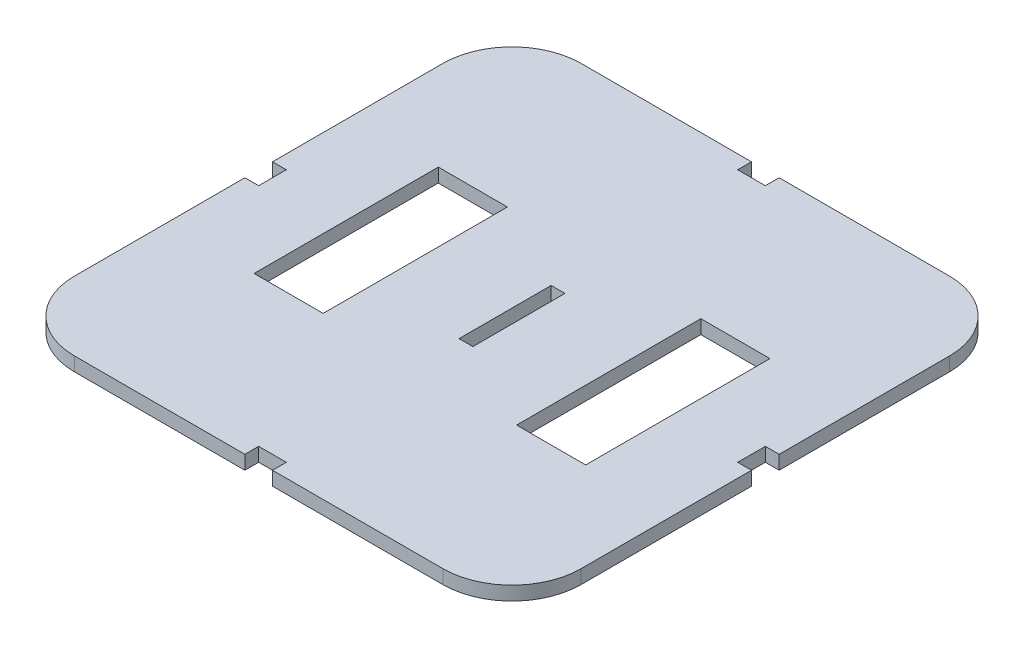
ISO-10303-21;
HEADER;
FILE_DESCRIPTION(('STEP AP214'),'2;1');
FILE_NAME('part.step','',(''),(''),'','','');
FILE_SCHEMA(('AUTOMOTIVE_DESIGN { 1 0 10303 214 1 1 1 1 }'));
ENDSEC;
DATA;
#1=APPLICATION_CONTEXT('core data for automotive mechanical design processes');
#2=APPLICATION_PROTOCOL_DEFINITION('international standard','automotive_design',2000,#1);
#3=PRODUCT_CONTEXT('',#1,'mechanical');
#4=PRODUCT('Part','Part','',(#3));
#5=PRODUCT_RELATED_PRODUCT_CATEGORY('part','',(#4));
#6=PRODUCT_DEFINITION_FORMATION('','',#4);
#7=PRODUCT_DEFINITION_CONTEXT('part definition',#1,'design');
#8=PRODUCT_DEFINITION('design','',#6,#7);
#9=PRODUCT_DEFINITION_SHAPE('','',#8);
#10=(LENGTH_UNIT() NAMED_UNIT(*) SI_UNIT(.MILLI.,.METRE.));
#11=(NAMED_UNIT(*) PLANE_ANGLE_UNIT() SI_UNIT($,.RADIAN.));
#12=(NAMED_UNIT(*) SI_UNIT($,.STERADIAN.) SOLID_ANGLE_UNIT());
#13=UNCERTAINTY_MEASURE_WITH_UNIT(LENGTH_MEASURE(1.E-05),#10,'distance_accuracy_value','');
#14=(GEOMETRIC_REPRESENTATION_CONTEXT(3) GLOBAL_UNCERTAINTY_ASSIGNED_CONTEXT((#13)) GLOBAL_UNIT_ASSIGNED_CONTEXT((#10,
#11,#12)) REPRESENTATION_CONTEXT('',''));
#15=CARTESIAN_POINT('',(0.,0.,0.));
#16=DIRECTION('',(0.,0.,1.));
#17=DIRECTION('',(1.,0.,0.));
#18=AXIS2_PLACEMENT_3D('',#15,#16,#17);
#19=CARTESIAN_POINT('',(0.,3.,-52.));
#20=DIRECTION('',(0.,0.,-1.));
#21=DIRECTION('',(-1.,0.,0.));
#22=AXIS2_PLACEMENT_3D('',#19,#20,#21);
#23=PLANE('',#22);
#24=DIRECTION('',(1.,0.,0.));
#25=VECTOR('',#24,1.);
#26=CARTESIAN_POINT('',(0.,0.,-52.));
#27=LINE('',#26,#25);
#28=CARTESIAN_POINT('',(107.,0.,-52.));
#29=VERTEX_POINT('',#28);
#30=CARTESIAN_POINT('',(110.,0.,-52.));
#31=VERTEX_POINT('',#30);
#32=EDGE_CURVE('E309',#29,#31,#27,.T.);
#33=ORIENTED_EDGE('',*,*,#32,.F.);
#34=DIRECTION('',(0.,-1.,0.));
#35=VECTOR('',#34,1.);
#36=CARTESIAN_POINT('',(107.,3.,-52.));
#37=LINE('',#36,#35);
#38=CARTESIAN_POINT('',(107.,3.,-52.));
#39=VERTEX_POINT('',#38);
#40=EDGE_CURVE('E483',#39,#29,#37,.T.);
#41=ORIENTED_EDGE('',*,*,#40,.F.);
#42=DIRECTION('',(1.,0.,0.));
#43=VECTOR('',#42,1.);
#44=CARTESIAN_POINT('',(0.,3.,-52.));
#45=LINE('',#44,#43);
#46=CARTESIAN_POINT('',(110.,3.,-52.));
#47=VERTEX_POINT('',#46);
#48=EDGE_CURVE('E350',#39,#47,#45,.T.);
#49=ORIENTED_EDGE('',*,*,#48,.T.);
#50=DIRECTION('',(0.,-1.,0.));
#51=VECTOR('',#50,1.);
#52=CARTESIAN_POINT('',(110.,3.,-52.));
#53=LINE('',#52,#51);
#54=EDGE_CURVE('E447',#47,#31,#53,.T.);
#55=ORIENTED_EDGE('',*,*,#54,.T.);
#56=EDGE_LOOP('',(#33,#41,#49,#55));
#57=FACE_BOUND('',#56,.T.);
#58=ADVANCED_FACE('F45',(#57),#23,.T.);
#59=CARTESIAN_POINT('',(107.,3.,0.));
#60=DIRECTION('',(1.,0.,0.));
#61=DIRECTION('',(0.,0.,-1.));
#62=AXIS2_PLACEMENT_3D('',#59,#60,#61);
#63=PLANE('',#62);
#64=DIRECTION('',(0.,0.,1.));
#65=VECTOR('',#64,1.);
#66=CARTESIAN_POINT('',(107.,0.,0.));
#67=LINE('',#66,#65);
#68=CARTESIAN_POINT('',(107.,0.,-58.));
#69=VERTEX_POINT('',#68);
#70=EDGE_CURVE('E402',#69,#29,#67,.T.);
#71=ORIENTED_EDGE('',*,*,#70,.F.);
#72=DIRECTION('',(0.,-1.,0.));
#73=VECTOR('',#72,1.);
#74=CARTESIAN_POINT('',(107.,3.,-58.));
#75=LINE('',#74,#73);
#76=CARTESIAN_POINT('',(107.,3.,-58.));
#77=VERTEX_POINT('',#76);
#78=EDGE_CURVE('E481',#77,#69,#75,.T.);
#79=ORIENTED_EDGE('',*,*,#78,.F.);
#80=DIRECTION('',(0.,0.,1.));
#81=VECTOR('',#80,1.);
#82=CARTESIAN_POINT('',(107.,3.,0.));
#83=LINE('',#82,#81);
#84=EDGE_CURVE('E353',#77,#39,#83,.T.);
#85=ORIENTED_EDGE('',*,*,#84,.T.);
#86=ORIENTED_EDGE('',*,*,#40,.T.);
#87=EDGE_LOOP('',(#71,#79,#85,#86));
#88=FACE_BOUND('',#87,.T.);
#89=ADVANCED_FACE('F569',(#88),#63,.T.);
#90=CARTESIAN_POINT('',(0.,3.,-58.));
#91=DIRECTION('',(0.,0.,-1.));
#92=DIRECTION('',(-1.,0.,0.));
#93=AXIS2_PLACEMENT_3D('',#90,#91,#92);
#94=PLANE('',#93);
#95=DIRECTION('',(1.,0.,0.));
#96=VECTOR('',#95,1.);
#97=CARTESIAN_POINT('',(0.,0.,-58.));
#98=LINE('',#97,#96);
#99=CARTESIAN_POINT('',(110.,0.,-58.));
#100=VERTEX_POINT('',#99);
#101=EDGE_CURVE('E405',#69,#100,#98,.T.);
#102=ORIENTED_EDGE('',*,*,#101,.T.);
#103=DIRECTION('',(0.,-1.,0.));
#104=VECTOR('',#103,1.);
#105=CARTESIAN_POINT('',(110.,3.,-58.));
#106=LINE('',#105,#104);
#107=CARTESIAN_POINT('',(110.,3.,-58.));
#108=VERTEX_POINT('',#107);
#109=EDGE_CURVE('E478',#108,#100,#106,.T.);
#110=ORIENTED_EDGE('',*,*,#109,.F.);
#111=DIRECTION('',(1.,0.,0.));
#112=VECTOR('',#111,1.);
#113=CARTESIAN_POINT('',(0.,3.,-58.));
#114=LINE('',#113,#112);
#115=EDGE_CURVE('E357',#77,#108,#114,.T.);
#116=ORIENTED_EDGE('',*,*,#115,.F.);
#117=ORIENTED_EDGE('',*,*,#78,.T.);
#118=EDGE_LOOP('',(#102,#110,#116,#117));
#119=FACE_BOUND('',#118,.T.);
#120=ADVANCED_FACE('F575',(#119),#94,.F.);
#121=CARTESIAN_POINT('',(110.,3.,0.));
#122=DIRECTION('',(-1.,0.,0.));
#123=DIRECTION('',(0.,0.,1.));
#124=AXIS2_PLACEMENT_3D('',#121,#122,#123);
#125=PLANE('',#124);
#126=DIRECTION('',(0.,0.,-1.));
#127=VECTOR('',#126,1.);
#128=CARTESIAN_POINT('',(110.,0.,0.));
#129=LINE('',#128,#127);
#130=CARTESIAN_POINT('',(110.,0.,-95.));
#131=VERTEX_POINT('',#130);
#132=EDGE_CURVE('E407',#100,#131,#129,.T.);
#133=ORIENTED_EDGE('',*,*,#132,.T.);
#134=DIRECTION('',(0.,-1.,0.));
#135=VECTOR('',#134,1.);
#136=CARTESIAN_POINT('',(110.,3.,-95.));
#137=LINE('',#136,#135);
#138=CARTESIAN_POINT('',(110.,3.,-95.));
#139=VERTEX_POINT('',#138);
#140=EDGE_CURVE('E514',#131,#139,#137,.F.);
#141=ORIENTED_EDGE('',*,*,#140,.T.);
#142=DIRECTION('',(0.,0.,-1.));
#143=VECTOR('',#142,1.);
#144=CARTESIAN_POINT('',(110.,3.,0.));
#145=LINE('',#144,#143);
#146=EDGE_CURVE('E359',#108,#139,#145,.T.);
#147=ORIENTED_EDGE('',*,*,#146,.F.);
#148=ORIENTED_EDGE('',*,*,#109,.T.);
#149=EDGE_LOOP('',(#133,#141,#147,#148));
#150=FACE_BOUND('',#149,.T.);
#151=ADVANCED_FACE('F687',(#150),#125,.F.);
#152=CARTESIAN_POINT('',(0.,3.,-110.));
#153=DIRECTION('',(0.,0.,-1.));
#154=DIRECTION('',(-1.,0.,0.));
#155=AXIS2_PLACEMENT_3D('',#152,#153,#154);
#156=PLANE('',#155);
#157=DIRECTION('',(1.,0.,0.));
#158=VECTOR('',#157,1.);
#159=CARTESIAN_POINT('',(0.,3.,-110.));
#160=LINE('',#159,#158);
#161=CARTESIAN_POINT('',(58.,3.,-110.));
#162=VERTEX_POINT('',#161);
#163=CARTESIAN_POINT('',(95.,3.,-110.));
#164=VERTEX_POINT('',#163);
#165=EDGE_CURVE('E362',#162,#164,#160,.T.);
#166=ORIENTED_EDGE('',*,*,#165,.T.);
#167=DIRECTION('',(0.,-1.,0.));
#168=VECTOR('',#167,1.);
#169=CARTESIAN_POINT('',(95.,0.,-110.));
#170=LINE('',#169,#168);
#171=CARTESIAN_POINT('',(95.,0.,-110.));
#172=VERTEX_POINT('',#171);
#173=EDGE_CURVE('E511',#164,#172,#170,.T.);
#174=ORIENTED_EDGE('',*,*,#173,.T.);
#175=DIRECTION('',(1.,0.,0.));
#176=VECTOR('',#175,1.);
#177=CARTESIAN_POINT('',(0.,0.,-110.));
#178=LINE('',#177,#176);
#179=CARTESIAN_POINT('',(58.,0.,-110.));
#180=VERTEX_POINT('',#179);
#181=EDGE_CURVE('E410',#180,#172,#178,.T.);
#182=ORIENTED_EDGE('',*,*,#181,.F.);
#183=DIRECTION('',(0.,-1.,0.));
#184=VECTOR('',#183,1.);
#185=CARTESIAN_POINT('',(58.,3.,-110.));
#186=LINE('',#185,#184);
#187=EDGE_CURVE('E476',#162,#180,#186,.T.);
#188=ORIENTED_EDGE('',*,*,#187,.F.);
#189=EDGE_LOOP('',(#166,#174,#182,#188));
#190=FACE_BOUND('',#189,.T.);
#191=ADVANCED_FACE('F605',(#190),#156,.T.);
#192=CARTESIAN_POINT('',(57.9999999999995,3.,2.68303897617744E-13));
#193=DIRECTION('',(-1.,0.,0.));
#194=DIRECTION('',(0.,0.,1.));
#195=AXIS2_PLACEMENT_3D('',#192,#193,#194);
#196=PLANE('',#195);
#197=DIRECTION('',(0.,0.,-1.));
#198=VECTOR('',#197,1.);
#199=CARTESIAN_POINT('',(57.9999999999995,0.,2.68303897617744E-13));
#200=LINE('',#199,#198);
#201=CARTESIAN_POINT('',(58.,0.,-107.));
#202=VERTEX_POINT('',#201);
#203=EDGE_CURVE('E413',#202,#180,#200,.T.);
#204=ORIENTED_EDGE('',*,*,#203,.F.);
#205=DIRECTION('',(0.,-1.,0.));
#206=VECTOR('',#205,1.);
#207=CARTESIAN_POINT('',(58.,3.,-107.));
#208=LINE('',#207,#206);
#209=CARTESIAN_POINT('',(58.,3.,-107.));
#210=VERTEX_POINT('',#209);
#211=EDGE_CURVE('E474',#210,#202,#208,.T.);
#212=ORIENTED_EDGE('',*,*,#211,.F.);
#213=DIRECTION('',(0.,0.,-1.));
#214=VECTOR('',#213,1.);
#215=CARTESIAN_POINT('',(57.9999999999995,3.,2.68303897617744E-13));
#216=LINE('',#215,#214);
#217=EDGE_CURVE('E366',#210,#162,#216,.T.);
#218=ORIENTED_EDGE('',*,*,#217,.T.);
#219=ORIENTED_EDGE('',*,*,#187,.T.);
#220=EDGE_LOOP('',(#204,#212,#218,#219));
#221=FACE_BOUND('',#220,.T.);
#222=ADVANCED_FACE('F609',(#221),#196,.T.);
#223=CARTESIAN_POINT('',(0.,3.,-107.));
#224=DIRECTION('',(0.,0.,-1.));
#225=DIRECTION('',(-1.,0.,0.));
#226=AXIS2_PLACEMENT_3D('',#223,#224,#225);
#227=PLANE('',#226);
#228=DIRECTION('',(1.,0.,0.));
#229=VECTOR('',#228,1.);
#230=CARTESIAN_POINT('',(0.,0.,-107.));
#231=LINE('',#230,#229);
#232=CARTESIAN_POINT('',(52.,0.,-107.));
#233=VERTEX_POINT('',#232);
#234=EDGE_CURVE('E417',#233,#202,#231,.T.);
#235=ORIENTED_EDGE('',*,*,#234,.F.);
#236=DIRECTION('',(0.,-1.,0.));
#237=VECTOR('',#236,1.);
#238=CARTESIAN_POINT('',(52.,3.,-107.));
#239=LINE('',#238,#237);
#240=CARTESIAN_POINT('',(52.,3.,-107.));
#241=VERTEX_POINT('',#240);
#242=EDGE_CURVE('E472',#241,#233,#239,.T.);
#243=ORIENTED_EDGE('',*,*,#242,.F.);
#244=DIRECTION('',(1.,0.,0.));
#245=VECTOR('',#244,1.);
#246=CARTESIAN_POINT('',(0.,3.,-107.));
#247=LINE('',#246,#245);
#248=EDGE_CURVE('E370',#241,#210,#247,.T.);
#249=ORIENTED_EDGE('',*,*,#248,.T.);
#250=ORIENTED_EDGE('',*,*,#211,.T.);
#251=EDGE_LOOP('',(#235,#243,#249,#250));
#252=FACE_BOUND('',#251,.T.);
#253=ADVANCED_FACE('F613',(#252),#227,.T.);
#254=CARTESIAN_POINT('',(51.9999999999995,3.,2.40548322002115E-13));
#255=DIRECTION('',(-1.,0.,0.));
#256=DIRECTION('',(0.,0.,1.));
#257=AXIS2_PLACEMENT_3D('',#254,#255,#256);
#258=PLANE('',#257);
#259=DIRECTION('',(0.,0.,-1.));
#260=VECTOR('',#259,1.);
#261=CARTESIAN_POINT('',(51.9999999999995,0.,2.40548322002115E-13));
#262=LINE('',#261,#260);
#263=CARTESIAN_POINT('',(52.,0.,-110.));
#264=VERTEX_POINT('',#263);
#265=EDGE_CURVE('E420',#233,#264,#262,.T.);
#266=ORIENTED_EDGE('',*,*,#265,.T.);
#267=DIRECTION('',(0.,-1.,0.));
#268=VECTOR('',#267,1.);
#269=CARTESIAN_POINT('',(52.,3.,-110.));
#270=LINE('',#269,#268);
#271=CARTESIAN_POINT('',(52.,3.,-110.));
#272=VERTEX_POINT('',#271);
#273=EDGE_CURVE('E469',#272,#264,#270,.T.);
#274=ORIENTED_EDGE('',*,*,#273,.F.);
#275=DIRECTION('',(0.,0.,-1.));
#276=VECTOR('',#275,1.);
#277=CARTESIAN_POINT('',(51.9999999999995,3.,2.40548322002115E-13));
#278=LINE('',#277,#276);
#279=EDGE_CURVE('E373',#241,#272,#278,.T.);
#280=ORIENTED_EDGE('',*,*,#279,.F.);
#281=ORIENTED_EDGE('',*,*,#242,.T.);
#282=EDGE_LOOP('',(#266,#274,#280,#281));
#283=FACE_BOUND('',#282,.T.);
#284=ADVANCED_FACE('F618',(#283),#258,.F.);
#285=CARTESIAN_POINT('',(15.,0.,-110.));
#286=VERTEX_POINT('',#285);
#287=EDGE_CURVE('E414',#286,#264,#178,.T.);
#288=ORIENTED_EDGE('',*,*,#287,.F.);
#289=DIRECTION('',(0.,-1.,0.));
#290=VECTOR('',#289,1.);
#291=CARTESIAN_POINT('',(15.,3.,-110.));
#292=LINE('',#291,#290);
#293=CARTESIAN_POINT('',(15.,3.,-110.));
#294=VERTEX_POINT('',#293);
#295=EDGE_CURVE('E496',#286,#294,#292,.F.);
#296=ORIENTED_EDGE('',*,*,#295,.T.);
#297=EDGE_CURVE('E367',#294,#272,#160,.T.);
#298=ORIENTED_EDGE('',*,*,#297,.T.);
#299=ORIENTED_EDGE('',*,*,#273,.T.);
#300=EDGE_LOOP('',(#288,#296,#298,#299));
#301=FACE_BOUND('',#300,.T.);
#302=ADVANCED_FACE('F702',(#301),#156,.T.);
#303=CARTESIAN_POINT('',(0.,3.,0.));
#304=DIRECTION('',(-1.,0.,0.));
#305=DIRECTION('',(0.,0.,1.));
#306=AXIS2_PLACEMENT_3D('',#303,#304,#305);
#307=PLANE('',#306);
#308=DIRECTION('',(0.,0.,-1.));
#309=VECTOR('',#308,1.);
#310=CARTESIAN_POINT('',(0.,3.,0.));
#311=LINE('',#310,#309);
#312=CARTESIAN_POINT('',(0.,3.,-58.));
#313=VERTEX_POINT('',#312);
#314=CARTESIAN_POINT('',(0.,3.,-95.));
#315=VERTEX_POINT('',#314);
#316=EDGE_CURVE('E376',#313,#315,#311,.T.);
#317=ORIENTED_EDGE('',*,*,#316,.T.);
#318=DIRECTION('',(0.,-1.,0.));
#319=VECTOR('',#318,1.);
#320=CARTESIAN_POINT('',(0.,3.,-95.));
#321=LINE('',#320,#319);
#322=CARTESIAN_POINT('',(0.,0.,-95.));
#323=VERTEX_POINT('',#322);
#324=EDGE_CURVE('E485',#315,#323,#321,.T.);
#325=ORIENTED_EDGE('',*,*,#324,.T.);
#326=DIRECTION('',(0.,0.,-1.));
#327=VECTOR('',#326,1.);
#328=CARTESIAN_POINT('',(0.,0.,0.));
#329=LINE('',#328,#327);
#330=CARTESIAN_POINT('',(0.,0.,-58.));
#331=VERTEX_POINT('',#330);
#332=EDGE_CURVE('E423',#331,#323,#329,.T.);
#333=ORIENTED_EDGE('',*,*,#332,.F.);
#334=DIRECTION('',(0.,-1.,0.));
#335=VECTOR('',#334,1.);
#336=CARTESIAN_POINT('',(0.,3.,-58.));
#337=LINE('',#336,#335);
#338=EDGE_CURVE('E467',#313,#331,#337,.T.);
#339=ORIENTED_EDGE('',*,*,#338,.F.);
#340=EDGE_LOOP('',(#317,#325,#333,#339));
#341=FACE_BOUND('',#340,.T.);
#342=ADVANCED_FACE('F626',(#341),#307,.T.);
#343=CARTESIAN_POINT('',(0.,3.,-58.));
#344=DIRECTION('',(0.,0.,1.));
#345=DIRECTION('',(1.,0.,0.));
#346=AXIS2_PLACEMENT_3D('',#343,#344,#345);
#347=PLANE('',#346);
#348=DIRECTION('',(-1.,0.,0.));
#349=VECTOR('',#348,1.);
#350=CARTESIAN_POINT('',(0.,0.,-58.));
#351=LINE('',#350,#349);
#352=CARTESIAN_POINT('',(3.,0.,-58.));
#353=VERTEX_POINT('',#352);
#354=EDGE_CURVE('E426',#353,#331,#351,.T.);
#355=ORIENTED_EDGE('',*,*,#354,.F.);
#356=DIRECTION('',(0.,-1.,0.));
#357=VECTOR('',#356,1.);
#358=CARTESIAN_POINT('',(3.,3.,-58.));
#359=LINE('',#358,#357);
#360=CARTESIAN_POINT('',(3.,3.,-58.));
#361=VERTEX_POINT('',#360);
#362=EDGE_CURVE('E465',#361,#353,#359,.T.);
#363=ORIENTED_EDGE('',*,*,#362,.F.);
#364=DIRECTION('',(-1.,0.,0.));
#365=VECTOR('',#364,1.);
#366=CARTESIAN_POINT('',(0.,3.,-58.));
#367=LINE('',#366,#365);
#368=EDGE_CURVE('E379',#361,#313,#367,.T.);
#369=ORIENTED_EDGE('',*,*,#368,.T.);
#370=ORIENTED_EDGE('',*,*,#338,.T.);
#371=EDGE_LOOP('',(#355,#363,#369,#370));
#372=FACE_BOUND('',#371,.T.);
#373=ADVANCED_FACE('F633',(#372),#347,.T.);
#374=CARTESIAN_POINT('',(3.,3.,0.));
#375=DIRECTION('',(-1.,0.,0.));
#376=DIRECTION('',(0.,0.,1.));
#377=AXIS2_PLACEMENT_3D('',#374,#375,#376);
#378=PLANE('',#377);
#379=DIRECTION('',(0.,0.,-1.));
#380=VECTOR('',#379,1.);
#381=CARTESIAN_POINT('',(3.,0.,0.));
#382=LINE('',#381,#380);
#383=CARTESIAN_POINT('',(3.,0.,-52.));
#384=VERTEX_POINT('',#383);
#385=EDGE_CURVE('E430',#384,#353,#382,.T.);
#386=ORIENTED_EDGE('',*,*,#385,.F.);
#387=DIRECTION('',(0.,-1.,0.));
#388=VECTOR('',#387,1.);
#389=CARTESIAN_POINT('',(3.,3.,-52.));
#390=LINE('',#389,#388);
#391=CARTESIAN_POINT('',(3.,3.,-52.));
#392=VERTEX_POINT('',#391);
#393=EDGE_CURVE('E463',#392,#384,#390,.T.);
#394=ORIENTED_EDGE('',*,*,#393,.F.);
#395=DIRECTION('',(0.,0.,-1.));
#396=VECTOR('',#395,1.);
#397=CARTESIAN_POINT('',(3.,3.,0.));
#398=LINE('',#397,#396);
#399=EDGE_CURVE('E383',#392,#361,#398,.T.);
#400=ORIENTED_EDGE('',*,*,#399,.T.);
#401=ORIENTED_EDGE('',*,*,#362,.T.);
#402=EDGE_LOOP('',(#386,#394,#400,#401));
#403=FACE_BOUND('',#402,.T.);
#404=ADVANCED_FACE('F637',(#403),#378,.T.);
#405=CARTESIAN_POINT('',(0.,3.,-52.));
#406=DIRECTION('',(0.,0.,1.));
#407=DIRECTION('',(1.,0.,0.));
#408=AXIS2_PLACEMENT_3D('',#405,#406,#407);
#409=PLANE('',#408);
#410=DIRECTION('',(-1.,0.,0.));
#411=VECTOR('',#410,1.);
#412=CARTESIAN_POINT('',(0.,0.,-52.));
#413=LINE('',#412,#411);
#414=CARTESIAN_POINT('',(0.,0.,-52.));
#415=VERTEX_POINT('',#414);
#416=EDGE_CURVE('E433',#384,#415,#413,.T.);
#417=ORIENTED_EDGE('',*,*,#416,.T.);
#418=DIRECTION('',(0.,-1.,0.));
#419=VECTOR('',#418,1.);
#420=CARTESIAN_POINT('',(0.,3.,-52.));
#421=LINE('',#420,#419);
#422=CARTESIAN_POINT('',(0.,3.,-52.));
#423=VERTEX_POINT('',#422);
#424=EDGE_CURVE('E460',#423,#415,#421,.T.);
#425=ORIENTED_EDGE('',*,*,#424,.F.);
#426=DIRECTION('',(-1.,0.,0.));
#427=VECTOR('',#426,1.);
#428=CARTESIAN_POINT('',(0.,3.,-52.));
#429=LINE('',#428,#427);
#430=EDGE_CURVE('E386',#392,#423,#429,.T.);
#431=ORIENTED_EDGE('',*,*,#430,.F.);
#432=ORIENTED_EDGE('',*,*,#393,.T.);
#433=EDGE_LOOP('',(#417,#425,#431,#432));
#434=FACE_BOUND('',#433,.T.);
#435=ADVANCED_FACE('F641',(#434),#409,.F.);
#436=CARTESIAN_POINT('',(0.,0.,-15.));
#437=VERTEX_POINT('',#436);
#438=EDGE_CURVE('E427',#437,#415,#329,.T.);
#439=ORIENTED_EDGE('',*,*,#438,.F.);
#440=DIRECTION('',(0.,-1.,0.));
#441=VECTOR('',#440,1.);
#442=CARTESIAN_POINT('',(0.,3.,-15.));
#443=LINE('',#442,#441);
#444=CARTESIAN_POINT('',(0.,3.,-15.));
#445=VERTEX_POINT('',#444);
#446=EDGE_CURVE('E509',#437,#445,#443,.F.);
#447=ORIENTED_EDGE('',*,*,#446,.T.);
#448=EDGE_CURVE('E380',#445,#423,#311,.T.);
#449=ORIENTED_EDGE('',*,*,#448,.T.);
#450=ORIENTED_EDGE('',*,*,#424,.T.);
#451=EDGE_LOOP('',(#439,#447,#449,#450));
#452=FACE_BOUND('',#451,.T.);
#453=ADVANCED_FACE('F690',(#452),#307,.T.);
#454=CARTESIAN_POINT('',(0.,3.,0.));
#455=DIRECTION('',(0.,0.,-1.));
#456=DIRECTION('',(-1.,0.,0.));
#457=AXIS2_PLACEMENT_3D('',#454,#455,#456);
#458=PLANE('',#457);
#459=DIRECTION('',(1.,0.,0.));
#460=VECTOR('',#459,1.);
#461=CARTESIAN_POINT('',(0.,3.,0.));
#462=LINE('',#461,#460);
#463=CARTESIAN_POINT('',(15.,3.,0.));
#464=VERTEX_POINT('',#463);
#465=CARTESIAN_POINT('',(52.,3.,0.));
#466=VERTEX_POINT('',#465);
#467=EDGE_CURVE('E389',#464,#466,#462,.T.);
#468=ORIENTED_EDGE('',*,*,#467,.F.);
#469=DIRECTION('',(0.,-1.,0.));
#470=VECTOR('',#469,1.);
#471=CARTESIAN_POINT('',(15.,0.,0.));
#472=LINE('',#471,#470);
#473=CARTESIAN_POINT('',(15.,0.,0.));
#474=VERTEX_POINT('',#473);
#475=EDGE_CURVE('E506',#464,#474,#472,.T.);
#476=ORIENTED_EDGE('',*,*,#475,.T.);
#477=DIRECTION('',(1.,0.,0.));
#478=VECTOR('',#477,1.);
#479=CARTESIAN_POINT('',(0.,0.,0.));
#480=LINE('',#479,#478);
#481=CARTESIAN_POINT('',(52.,0.,0.));
#482=VERTEX_POINT('',#481);
#483=EDGE_CURVE('E436',#474,#482,#480,.T.);
#484=ORIENTED_EDGE('',*,*,#483,.T.);
#485=DIRECTION('',(0.,-1.,0.));
#486=VECTOR('',#485,1.);
#487=CARTESIAN_POINT('',(52.,3.,0.));
#488=LINE('',#487,#486);
#489=EDGE_CURVE('E457',#466,#482,#488,.T.);
#490=ORIENTED_EDGE('',*,*,#489,.F.);
#491=EDGE_LOOP('',(#468,#476,#484,#490));
#492=FACE_BOUND('',#491,.T.);
#493=ADVANCED_FACE('F650',(#492),#458,.F.);
#494=CARTESIAN_POINT('',(52.,3.,-2.40548322002117E-13));
#495=DIRECTION('',(1.,0.,0.));
#496=DIRECTION('',(0.,0.,-1.));
#497=AXIS2_PLACEMENT_3D('',#494,#495,#496);
#498=PLANE('',#497);
#499=DIRECTION('',(0.,0.,1.));
#500=VECTOR('',#499,1.);
#501=CARTESIAN_POINT('',(52.,0.,-2.40548322002117E-13));
#502=LINE('',#501,#500);
#503=CARTESIAN_POINT('',(52.,0.,-3.));
#504=VERTEX_POINT('',#503);
#505=EDGE_CURVE('E438',#504,#482,#502,.T.);
#506=ORIENTED_EDGE('',*,*,#505,.F.);
#507=DIRECTION('',(0.,-1.,0.));
#508=VECTOR('',#507,1.);
#509=CARTESIAN_POINT('',(52.,3.,-3.));
#510=LINE('',#509,#508);
#511=CARTESIAN_POINT('',(52.,3.,-3.));
#512=VERTEX_POINT('',#511);
#513=EDGE_CURVE('E455',#512,#504,#510,.T.);
#514=ORIENTED_EDGE('',*,*,#513,.F.);
#515=DIRECTION('',(0.,0.,1.));
#516=VECTOR('',#515,1.);
#517=CARTESIAN_POINT('',(52.,3.,-2.40548322002117E-13));
#518=LINE('',#517,#516);
#519=EDGE_CURVE('E391',#512,#466,#518,.T.);
#520=ORIENTED_EDGE('',*,*,#519,.T.);
#521=ORIENTED_EDGE('',*,*,#489,.T.);
#522=EDGE_LOOP('',(#506,#514,#520,#521));
#523=FACE_BOUND('',#522,.T.);
#524=ADVANCED_FACE('F657',(#523),#498,.T.);
#525=CARTESIAN_POINT('',(0.,3.,-3.));
#526=DIRECTION('',(0.,0.,1.));
#527=DIRECTION('',(1.,0.,0.));
#528=AXIS2_PLACEMENT_3D('',#525,#526,#527);
#529=PLANE('',#528);
#530=DIRECTION('',(-1.,0.,0.));
#531=VECTOR('',#530,1.);
#532=CARTESIAN_POINT('',(0.,0.,-3.));
#533=LINE('',#532,#531);
#534=CARTESIAN_POINT('',(58.,0.,-3.));
#535=VERTEX_POINT('',#534);
#536=EDGE_CURVE('E442',#535,#504,#533,.T.);
#537=ORIENTED_EDGE('',*,*,#536,.F.);
#538=DIRECTION('',(0.,-1.,0.));
#539=VECTOR('',#538,1.);
#540=CARTESIAN_POINT('',(58.,3.,-3.));
#541=LINE('',#540,#539);
#542=CARTESIAN_POINT('',(58.,3.,-3.));
#543=VERTEX_POINT('',#542);
#544=EDGE_CURVE('E453',#543,#535,#541,.T.);
#545=ORIENTED_EDGE('',*,*,#544,.F.);
#546=DIRECTION('',(-1.,0.,0.));
#547=VECTOR('',#546,1.);
#548=CARTESIAN_POINT('',(0.,3.,-3.));
#549=LINE('',#548,#547);
#550=EDGE_CURVE('E395',#543,#512,#549,.T.);
#551=ORIENTED_EDGE('',*,*,#550,.T.);
#552=ORIENTED_EDGE('',*,*,#513,.T.);
#553=EDGE_LOOP('',(#537,#545,#551,#552));
#554=FACE_BOUND('',#553,.T.);
#555=ADVANCED_FACE('F661',(#554),#529,.T.);
#556=CARTESIAN_POINT('',(58.,3.,-2.68303897617746E-13));
#557=DIRECTION('',(1.,0.,0.));
#558=DIRECTION('',(0.,0.,-1.));
#559=AXIS2_PLACEMENT_3D('',#556,#557,#558);
#560=PLANE('',#559);
#561=DIRECTION('',(0.,0.,1.));
#562=VECTOR('',#561,1.);
#563=CARTESIAN_POINT('',(58.,0.,-2.68303897617746E-13));
#564=LINE('',#563,#562);
#565=CARTESIAN_POINT('',(58.,0.,0.));
#566=VERTEX_POINT('',#565);
#567=EDGE_CURVE('E445',#535,#566,#564,.T.);
#568=ORIENTED_EDGE('',*,*,#567,.T.);
#569=DIRECTION('',(0.,-1.,0.));
#570=VECTOR('',#569,1.);
#571=CARTESIAN_POINT('',(58.,3.,0.));
#572=LINE('',#571,#570);
#573=CARTESIAN_POINT('',(58.,3.,0.));
#574=VERTEX_POINT('',#573);
#575=EDGE_CURVE('E450',#574,#566,#572,.T.);
#576=ORIENTED_EDGE('',*,*,#575,.F.);
#577=DIRECTION('',(0.,0.,1.));
#578=VECTOR('',#577,1.);
#579=CARTESIAN_POINT('',(58.,3.,-2.68303897617746E-13));
#580=LINE('',#579,#578);
#581=EDGE_CURVE('E398',#543,#574,#580,.T.);
#582=ORIENTED_EDGE('',*,*,#581,.F.);
#583=ORIENTED_EDGE('',*,*,#544,.T.);
#584=EDGE_LOOP('',(#568,#576,#582,#583));
#585=FACE_BOUND('',#584,.T.);
#586=ADVANCED_FACE('F665',(#585),#560,.F.);
#587=CARTESIAN_POINT('',(95.,0.,0.));
#588=VERTEX_POINT('',#587);
#589=EDGE_CURVE('E439',#566,#588,#480,.T.);
#590=ORIENTED_EDGE('',*,*,#589,.T.);
#591=DIRECTION('',(0.,-1.,0.));
#592=VECTOR('',#591,1.);
#593=CARTESIAN_POINT('',(95.,3.,0.));
#594=LINE('',#593,#592);
#595=CARTESIAN_POINT('',(95.,3.,0.));
#596=VERTEX_POINT('',#595);
#597=EDGE_CURVE('E519',#588,#596,#594,.F.);
#598=ORIENTED_EDGE('',*,*,#597,.T.);
#599=EDGE_CURVE('E392',#574,#596,#462,.T.);
#600=ORIENTED_EDGE('',*,*,#599,.F.);
#601=ORIENTED_EDGE('',*,*,#575,.T.);
#602=EDGE_LOOP('',(#590,#598,#600,#601));
#603=FACE_BOUND('',#602,.T.);
#604=ADVANCED_FACE('F679',(#603),#458,.F.);
#605=CARTESIAN_POINT('',(110.,3.,-15.));
#606=VERTEX_POINT('',#605);
#607=EDGE_CURVE('E363',#606,#47,#145,.T.);
#608=ORIENTED_EDGE('',*,*,#607,.F.);
#609=DIRECTION('',(0.,-1.,0.));
#610=VECTOR('',#609,1.);
#611=CARTESIAN_POINT('',(110.,3.,-15.));
#612=LINE('',#611,#610);
#613=CARTESIAN_POINT('',(110.,0.,-15.));
#614=VERTEX_POINT('',#613);
#615=EDGE_CURVE('E516',#606,#614,#612,.T.);
#616=ORIENTED_EDGE('',*,*,#615,.T.);
#617=EDGE_CURVE('E354',#614,#31,#129,.T.);
#618=ORIENTED_EDGE('',*,*,#617,.T.);
#619=ORIENTED_EDGE('',*,*,#54,.F.);
#620=EDGE_LOOP('',(#608,#616,#618,#619));
#621=FACE_BOUND('',#620,.T.);
#622=ADVANCED_FACE('F675',(#621),#125,.F.);
#623=CARTESIAN_POINT('',(0.,3.,0.));
#624=DIRECTION('',(0.,1.,0.));
#625=DIRECTION('',(0.,0.,1.));
#626=AXIS2_PLACEMENT_3D('',#623,#624,#625);
#627=PLANE('',#626);
#628=DIRECTION('',(0.,0.,1.));
#629=VECTOR('',#628,1.);
#630=CARTESIAN_POINT('',(19.,3.,-75.));
#631=LINE('',#630,#629);
#632=CARTESIAN_POINT('',(19.,3.,-75.));
#633=VERTEX_POINT('',#632);
#634=CARTESIAN_POINT('',(19.,3.,-35.));
#635=VERTEX_POINT('',#634);
#636=EDGE_CURVE('E60',#633,#635,#631,.T.);
#637=ORIENTED_EDGE('',*,*,#636,.F.);
#638=DIRECTION('',(-1.,0.,0.));
#639=VECTOR('',#638,1.);
#640=CARTESIAN_POINT('',(19.,3.,-75.));
#641=LINE('',#640,#639);
#642=CARTESIAN_POINT('',(34.,3.,-75.0000000000001));
#643=VERTEX_POINT('',#642);
#644=EDGE_CURVE('E302',#643,#633,#641,.T.);
#645=ORIENTED_EDGE('',*,*,#644,.F.);
#646=DIRECTION('',(0.,0.,-1.));
#647=VECTOR('',#646,1.);
#648=CARTESIAN_POINT('',(34.,3.,-75.0000000000001));
#649=LINE('',#648,#647);
#650=CARTESIAN_POINT('',(34.,3.,-35.));
#651=VERTEX_POINT('',#650);
#652=EDGE_CURVE('E285',#651,#643,#649,.T.);
#653=ORIENTED_EDGE('',*,*,#652,.F.);
#654=DIRECTION('',(1.,0.,0.));
#655=VECTOR('',#654,1.);
#656=CARTESIAN_POINT('',(19.,3.,-35.));
#657=LINE('',#656,#655);
#658=EDGE_CURVE('E295',#635,#651,#657,.T.);
#659=ORIENTED_EDGE('',*,*,#658,.F.);
#660=EDGE_LOOP('',(#637,#645,#653,#659));
#661=FACE_BOUND('',#660,.T.);
#662=DIRECTION('',(0.,0.,1.));
#663=VECTOR('',#662,1.);
#664=CARTESIAN_POINT('',(53.5,3.,-65.));
#665=LINE('',#664,#663);
#666=CARTESIAN_POINT('',(53.5,3.,-65.));
#667=VERTEX_POINT('',#666);
#668=CARTESIAN_POINT('',(53.5,3.,-45.));
#669=VERTEX_POINT('',#668);
#670=EDGE_CURVE('E68',#667,#669,#665,.T.);
#671=ORIENTED_EDGE('',*,*,#670,.F.);
#672=DIRECTION('',(-1.,0.,0.));
#673=VECTOR('',#672,1.);
#674=CARTESIAN_POINT('',(53.5,3.,-65.));
#675=LINE('',#674,#673);
#676=CARTESIAN_POINT('',(56.5,3.,-65.));
#677=VERTEX_POINT('',#676);
#678=EDGE_CURVE('E314',#677,#667,#675,.T.);
#679=ORIENTED_EDGE('',*,*,#678,.F.);
#680=DIRECTION('',(0.,0.,-1.));
#681=VECTOR('',#680,1.);
#682=CARTESIAN_POINT('',(56.5,3.,-65.));
#683=LINE('',#682,#681);
#684=CARTESIAN_POINT('',(56.5,3.,-45.));
#685=VERTEX_POINT('',#684);
#686=EDGE_CURVE('E324',#685,#677,#683,.T.);
#687=ORIENTED_EDGE('',*,*,#686,.F.);
#688=DIRECTION('',(1.,0.,0.));
#689=VECTOR('',#688,1.);
#690=CARTESIAN_POINT('',(53.5,3.,-45.));
#691=LINE('',#690,#689);
#692=EDGE_CURVE('E327',#669,#685,#691,.T.);
#693=ORIENTED_EDGE('',*,*,#692,.F.);
#694=EDGE_LOOP('',(#671,#679,#687,#693));
#695=FACE_BOUND('',#694,.T.);
#696=DIRECTION('',(0.,0.,1.));
#697=VECTOR('',#696,1.);
#698=CARTESIAN_POINT('',(76.,3.,-75.0000000000001));
#699=LINE('',#698,#697);
#700=CARTESIAN_POINT('',(76.,3.,-75.0000000000001));
#701=VERTEX_POINT('',#700);
#702=CARTESIAN_POINT('',(76.,3.,-35.));
#703=VERTEX_POINT('',#702);
#704=EDGE_CURVE('E321',#701,#703,#699,.T.);
#705=ORIENTED_EDGE('',*,*,#704,.F.);
#706=DIRECTION('',(-1.,0.,0.));
#707=VECTOR('',#706,1.);
#708=CARTESIAN_POINT('',(76.,3.,-75.0000000000001));
#709=LINE('',#708,#707);
#710=CARTESIAN_POINT('',(91.,3.,-75.0000000000001));
#711=VERTEX_POINT('',#710);
#712=EDGE_CURVE('E334',#711,#701,#709,.T.);
#713=ORIENTED_EDGE('',*,*,#712,.F.);
#714=DIRECTION('',(0.,0.,-1.));
#715=VECTOR('',#714,1.);
#716=CARTESIAN_POINT('',(91.,3.,-75.0000000000001));
#717=LINE('',#716,#715);
#718=CARTESIAN_POINT('',(91.,3.,-35.));
#719=VERTEX_POINT('',#718);
#720=EDGE_CURVE('E343',#719,#711,#717,.T.);
#721=ORIENTED_EDGE('',*,*,#720,.F.);
#722=DIRECTION('',(1.,0.,0.));
#723=VECTOR('',#722,1.);
#724=CARTESIAN_POINT('',(76.,3.,-35.));
#725=LINE('',#724,#723);
#726=EDGE_CURVE('E346',#703,#719,#725,.T.);
#727=ORIENTED_EDGE('',*,*,#726,.F.);
#728=EDGE_LOOP('',(#705,#713,#721,#727));
#729=FACE_BOUND('',#728,.T.);
#730=ORIENTED_EDGE('',*,*,#297,.F.);
#731=CARTESIAN_POINT('',(15.,3.,-95.));
#732=DIRECTION('',(0.,1.,0.));
#733=DIRECTION('',(0.,0.,1.));
#734=AXIS2_PLACEMENT_3D('',#731,#732,#733);
#735=CIRCLE('',#734,15.);
#736=EDGE_CURVE('E504',#294,#315,#735,.T.);
#737=ORIENTED_EDGE('',*,*,#736,.T.);
#738=ORIENTED_EDGE('',*,*,#316,.F.);
#739=ORIENTED_EDGE('',*,*,#368,.F.);
#740=ORIENTED_EDGE('',*,*,#399,.F.);
#741=ORIENTED_EDGE('',*,*,#430,.T.);
#742=ORIENTED_EDGE('',*,*,#448,.F.);
#743=CARTESIAN_POINT('',(15.,3.,-15.));
#744=DIRECTION('',(0.,1.,0.));
#745=DIRECTION('',(0.,0.,1.));
#746=AXIS2_PLACEMENT_3D('',#743,#744,#745);
#747=CIRCLE('',#746,15.);
#748=EDGE_CURVE('E502',#445,#464,#747,.T.);
#749=ORIENTED_EDGE('',*,*,#748,.T.);
#750=ORIENTED_EDGE('',*,*,#467,.T.);
#751=ORIENTED_EDGE('',*,*,#519,.F.);
#752=ORIENTED_EDGE('',*,*,#550,.F.);
#753=ORIENTED_EDGE('',*,*,#581,.T.);
#754=ORIENTED_EDGE('',*,*,#599,.T.);
#755=CARTESIAN_POINT('',(95.,3.,-15.));
#756=DIRECTION('',(0.,1.,0.));
#757=DIRECTION('',(0.,0.,1.));
#758=AXIS2_PLACEMENT_3D('',#755,#756,#757);
#759=CIRCLE('',#758,15.);
#760=EDGE_CURVE('E498',#596,#606,#759,.T.);
#761=ORIENTED_EDGE('',*,*,#760,.T.);
#762=ORIENTED_EDGE('',*,*,#607,.T.);
#763=ORIENTED_EDGE('',*,*,#48,.F.);
#764=ORIENTED_EDGE('',*,*,#84,.F.);
#765=ORIENTED_EDGE('',*,*,#115,.T.);
#766=ORIENTED_EDGE('',*,*,#146,.T.);
#767=CARTESIAN_POINT('',(95.,3.,-95.));
#768=DIRECTION('',(0.,1.,0.));
#769=DIRECTION('',(0.,0.,1.));
#770=AXIS2_PLACEMENT_3D('',#767,#768,#769);
#771=CIRCLE('',#770,15.);
#772=EDGE_CURVE('E500',#139,#164,#771,.T.);
#773=ORIENTED_EDGE('',*,*,#772,.T.);
#774=ORIENTED_EDGE('',*,*,#165,.F.);
#775=ORIENTED_EDGE('',*,*,#217,.F.);
#776=ORIENTED_EDGE('',*,*,#248,.F.);
#777=ORIENTED_EDGE('',*,*,#279,.T.);
#778=EDGE_LOOP('',(#730,#737,#738,#739,#740,#741,#742,#749,#750,#751,#752,#753,#754,#761,#762,
#763,#764,#765,#766,#773,#774,#775,#776,#777));
#779=FACE_BOUND('',#778,.T.);
#780=ADVANCED_FACE('F299',(#661,#695,#729,#779),#627,.T.);
#781=CARTESIAN_POINT('',(0.,0.,0.));
#782=DIRECTION('',(0.,1.,0.));
#783=DIRECTION('',(0.,0.,1.));
#784=AXIS2_PLACEMENT_3D('',#781,#782,#783);
#785=PLANE('',#784);
#786=DIRECTION('',(-1.,0.,0.));
#787=VECTOR('',#786,1.);
#788=CARTESIAN_POINT('',(0.,0.,-75.));
#789=LINE('',#788,#787);
#790=CARTESIAN_POINT('',(34.,0.,-75.0000000000001));
#791=VERTEX_POINT('',#790);
#792=CARTESIAN_POINT('',(19.,0.,-75.));
#793=VERTEX_POINT('',#792);
#794=EDGE_CURVE('E53',#791,#793,#789,.T.);
#795=ORIENTED_EDGE('',*,*,#794,.T.);
#796=DIRECTION('',(0.,0.,1.));
#797=VECTOR('',#796,1.);
#798=CARTESIAN_POINT('',(19.,0.,0.));
#799=LINE('',#798,#797);
#800=CARTESIAN_POINT('',(19.,0.,-35.));
#801=VERTEX_POINT('',#800);
#802=EDGE_CURVE('E11',#793,#801,#799,.T.);
#803=ORIENTED_EDGE('',*,*,#802,.T.);
#804=DIRECTION('',(1.,0.,0.));
#805=VECTOR('',#804,1.);
#806=CARTESIAN_POINT('',(0.,0.,-35.));
#807=LINE('',#806,#805);
#808=CARTESIAN_POINT('',(34.,0.,-35.));
#809=VERTEX_POINT('',#808);
#810=EDGE_CURVE('E545',#801,#809,#807,.T.);
#811=ORIENTED_EDGE('',*,*,#810,.T.);
#812=DIRECTION('',(0.,0.,-1.));
#813=VECTOR('',#812,1.);
#814=CARTESIAN_POINT('',(34.,0.,0.));
#815=LINE('',#814,#813);
#816=EDGE_CURVE('E288',#809,#791,#815,.T.);
#817=ORIENTED_EDGE('',*,*,#816,.T.);
#818=EDGE_LOOP('',(#795,#803,#811,#817));
#819=FACE_BOUND('',#818,.T.);
#820=DIRECTION('',(-1.,0.,0.));
#821=VECTOR('',#820,1.);
#822=CARTESIAN_POINT('',(0.,0.,-65.));
#823=LINE('',#822,#821);
#824=CARTESIAN_POINT('',(56.5,0.,-65.));
#825=VERTEX_POINT('',#824);
#826=CARTESIAN_POINT('',(53.5,0.,-65.));
#827=VERTEX_POINT('',#826);
#828=EDGE_CURVE('E539',#825,#827,#823,.T.);
#829=ORIENTED_EDGE('',*,*,#828,.T.);
#830=DIRECTION('',(0.,0.,1.));
#831=VECTOR('',#830,1.);
#832=CARTESIAN_POINT('',(53.5,0.,0.));
#833=LINE('',#832,#831);
#834=CARTESIAN_POINT('',(53.5,0.,-45.));
#835=VERTEX_POINT('',#834);
#836=EDGE_CURVE('E542',#827,#835,#833,.T.);
#837=ORIENTED_EDGE('',*,*,#836,.T.);
#838=DIRECTION('',(1.,0.,0.));
#839=VECTOR('',#838,1.);
#840=CARTESIAN_POINT('',(0.,0.,-45.));
#841=LINE('',#840,#839);
#842=CARTESIAN_POINT('',(56.5,0.,-45.));
#843=VERTEX_POINT('',#842);
#844=EDGE_CURVE('E533',#835,#843,#841,.T.);
#845=ORIENTED_EDGE('',*,*,#844,.T.);
#846=DIRECTION('',(0.,0.,-1.));
#847=VECTOR('',#846,1.);
#848=CARTESIAN_POINT('',(56.5,0.,0.));
#849=LINE('',#848,#847);
#850=EDGE_CURVE('E536',#843,#825,#849,.T.);
#851=ORIENTED_EDGE('',*,*,#850,.T.);
#852=EDGE_LOOP('',(#829,#837,#845,#851));
#853=FACE_BOUND('',#852,.T.);
#854=DIRECTION('',(-1.,0.,0.));
#855=VECTOR('',#854,1.);
#856=CARTESIAN_POINT('',(0.,0.,-75.0000000000001));
#857=LINE('',#856,#855);
#858=CARTESIAN_POINT('',(91.,0.,-75.0000000000001));
#859=VERTEX_POINT('',#858);
#860=CARTESIAN_POINT('',(76.,0.,-75.0000000000001));
#861=VERTEX_POINT('',#860);
#862=EDGE_CURVE('E527',#859,#861,#857,.T.);
#863=ORIENTED_EDGE('',*,*,#862,.T.);
#864=DIRECTION('',(0.,0.,1.));
#865=VECTOR('',#864,1.);
#866=CARTESIAN_POINT('',(76.,0.,0.));
#867=LINE('',#866,#865);
#868=CARTESIAN_POINT('',(76.,0.,-35.));
#869=VERTEX_POINT('',#868);
#870=EDGE_CURVE('E530',#861,#869,#867,.T.);
#871=ORIENTED_EDGE('',*,*,#870,.T.);
#872=DIRECTION('',(1.,0.,0.));
#873=VECTOR('',#872,1.);
#874=CARTESIAN_POINT('',(0.,0.,-35.));
#875=LINE('',#874,#873);
#876=CARTESIAN_POINT('',(91.,0.,-35.));
#877=VERTEX_POINT('',#876);
#878=EDGE_CURVE('E521',#869,#877,#875,.T.);
#879=ORIENTED_EDGE('',*,*,#878,.T.);
#880=DIRECTION('',(0.,0.,-1.));
#881=VECTOR('',#880,1.);
#882=CARTESIAN_POINT('',(91.,0.,0.));
#883=LINE('',#882,#881);
#884=EDGE_CURVE('E524',#877,#859,#883,.T.);
#885=ORIENTED_EDGE('',*,*,#884,.T.);
#886=EDGE_LOOP('',(#863,#871,#879,#885));
#887=FACE_BOUND('',#886,.T.);
#888=ORIENTED_EDGE('',*,*,#332,.T.);
#889=CARTESIAN_POINT('',(15.,0.,-95.));
#890=DIRECTION('',(0.,1.,0.));
#891=DIRECTION('',(0.,0.,1.));
#892=AXIS2_PLACEMENT_3D('',#889,#890,#891);
#893=CIRCLE('',#892,15.);
#894=EDGE_CURVE('E494',#323,#286,#893,.F.);
#895=ORIENTED_EDGE('',*,*,#894,.T.);
#896=ORIENTED_EDGE('',*,*,#287,.T.);
#897=ORIENTED_EDGE('',*,*,#265,.F.);
#898=ORIENTED_EDGE('',*,*,#234,.T.);
#899=ORIENTED_EDGE('',*,*,#203,.T.);
#900=ORIENTED_EDGE('',*,*,#181,.T.);
#901=CARTESIAN_POINT('',(95.,0.,-95.));
#902=DIRECTION('',(0.,1.,0.));
#903=DIRECTION('',(0.,0.,1.));
#904=AXIS2_PLACEMENT_3D('',#901,#902,#903);
#905=CIRCLE('',#904,15.);
#906=EDGE_CURVE('E490',#172,#131,#905,.F.);
#907=ORIENTED_EDGE('',*,*,#906,.T.);
#908=ORIENTED_EDGE('',*,*,#132,.F.);
#909=ORIENTED_EDGE('',*,*,#101,.F.);
#910=ORIENTED_EDGE('',*,*,#70,.T.);
#911=ORIENTED_EDGE('',*,*,#32,.T.);
#912=ORIENTED_EDGE('',*,*,#617,.F.);
#913=CARTESIAN_POINT('',(95.,0.,-15.));
#914=DIRECTION('',(0.,1.,0.));
#915=DIRECTION('',(0.,0.,1.));
#916=AXIS2_PLACEMENT_3D('',#913,#914,#915);
#917=CIRCLE('',#916,15.);
#918=EDGE_CURVE('E488',#614,#588,#917,.F.);
#919=ORIENTED_EDGE('',*,*,#918,.T.);
#920=ORIENTED_EDGE('',*,*,#589,.F.);
#921=ORIENTED_EDGE('',*,*,#567,.F.);
#922=ORIENTED_EDGE('',*,*,#536,.T.);
#923=ORIENTED_EDGE('',*,*,#505,.T.);
#924=ORIENTED_EDGE('',*,*,#483,.F.);
#925=CARTESIAN_POINT('',(15.,0.,-15.));
#926=DIRECTION('',(0.,1.,0.));
#927=DIRECTION('',(0.,0.,1.));
#928=AXIS2_PLACEMENT_3D('',#925,#926,#927);
#929=CIRCLE('',#928,15.);
#930=EDGE_CURVE('E492',#474,#437,#929,.F.);
#931=ORIENTED_EDGE('',*,*,#930,.T.);
#932=ORIENTED_EDGE('',*,*,#438,.T.);
#933=ORIENTED_EDGE('',*,*,#416,.F.);
#934=ORIENTED_EDGE('',*,*,#385,.T.);
#935=ORIENTED_EDGE('',*,*,#354,.T.);
#936=EDGE_LOOP('',(#888,#895,#896,#897,#898,#899,#900,#907,#908,#909,#910,#911,#912,#919,#920,
#921,#922,#923,#924,#931,#932,#933,#934,#935));
#937=FACE_BOUND('',#936,.T.);
#938=ADVANCED_FACE('F549',(#819,#853,#887,#937),#785,.F.);
#939=CARTESIAN_POINT('',(15.,3.,-95.));
#940=DIRECTION('',(0.,-1.,0.));
#941=DIRECTION('',(0.,0.,-1.));
#942=AXIS2_PLACEMENT_3D('',#939,#940,#941);
#943=CYLINDRICAL_SURFACE('',#942,15.);
#944=ORIENTED_EDGE('',*,*,#736,.F.);
#945=ORIENTED_EDGE('',*,*,#295,.F.);
#946=ORIENTED_EDGE('',*,*,#894,.F.);
#947=ORIENTED_EDGE('',*,*,#324,.F.);
#948=EDGE_LOOP('',(#944,#945,#946,#947));
#949=FACE_BOUND('',#948,.T.);
#950=ADVANCED_FACE('F581',(#949),#943,.T.);
#951=CARTESIAN_POINT('',(15.,3.,-15.));
#952=DIRECTION('',(0.,1.,0.));
#953=DIRECTION('',(0.,0.,1.));
#954=AXIS2_PLACEMENT_3D('',#951,#952,#953);
#955=CYLINDRICAL_SURFACE('',#954,15.);
#956=ORIENTED_EDGE('',*,*,#748,.F.);
#957=ORIENTED_EDGE('',*,*,#446,.F.);
#958=ORIENTED_EDGE('',*,*,#930,.F.);
#959=ORIENTED_EDGE('',*,*,#475,.F.);
#960=EDGE_LOOP('',(#956,#957,#958,#959));
#961=FACE_BOUND('',#960,.T.);
#962=ADVANCED_FACE('F584',(#961),#955,.T.);
#963=CARTESIAN_POINT('',(95.,3.,-95.));
#964=DIRECTION('',(0.,1.,0.));
#965=DIRECTION('',(0.,0.,1.));
#966=AXIS2_PLACEMENT_3D('',#963,#964,#965);
#967=CYLINDRICAL_SURFACE('',#966,15.);
#968=ORIENTED_EDGE('',*,*,#772,.F.);
#969=ORIENTED_EDGE('',*,*,#140,.F.);
#970=ORIENTED_EDGE('',*,*,#906,.F.);
#971=ORIENTED_EDGE('',*,*,#173,.F.);
#972=EDGE_LOOP('',(#968,#969,#970,#971));
#973=FACE_BOUND('',#972,.T.);
#974=ADVANCED_FACE('F587',(#973),#967,.T.);
#975=CARTESIAN_POINT('',(95.,3.,-15.));
#976=DIRECTION('',(0.,-1.,0.));
#977=DIRECTION('',(0.,0.,-1.));
#978=AXIS2_PLACEMENT_3D('',#975,#976,#977);
#979=CYLINDRICAL_SURFACE('',#978,15.);
#980=ORIENTED_EDGE('',*,*,#760,.F.);
#981=ORIENTED_EDGE('',*,*,#597,.F.);
#982=ORIENTED_EDGE('',*,*,#918,.F.);
#983=ORIENTED_EDGE('',*,*,#615,.F.);
#984=EDGE_LOOP('',(#980,#981,#982,#983));
#985=FACE_BOUND('',#984,.T.);
#986=ADVANCED_FACE('F47',(#985),#979,.T.);
#987=CARTESIAN_POINT('',(76.,-7.,-75.0000000000001));
#988=DIRECTION('',(-1.,0.,0.));
#989=DIRECTION('',(0.,0.,1.));
#990=AXIS2_PLACEMENT_3D('',#987,#988,#989);
#991=PLANE('',#990);
#992=DIRECTION('',(0.,1.,0.));
#993=VECTOR('',#992,1.);
#994=CARTESIAN_POINT('',(76.,-7.,-75.0000000000001));
#995=LINE('',#994,#993);
#996=EDGE_CURVE('E339',#861,#701,#995,.T.);
#997=ORIENTED_EDGE('',*,*,#996,.T.);
#998=ORIENTED_EDGE('',*,*,#704,.T.);
#999=DIRECTION('',(0.,1.,0.));
#1000=VECTOR('',#999,1.);
#1001=CARTESIAN_POINT('',(76.,-7.,-35.));
#1002=LINE('',#1001,#1000);
#1003=EDGE_CURVE('E331',#869,#703,#1002,.T.);
#1004=ORIENTED_EDGE('',*,*,#1003,.F.);
#1005=ORIENTED_EDGE('',*,*,#870,.F.);
#1006=EDGE_LOOP('',(#997,#998,#1004,#1005));
#1007=FACE_BOUND('',#1006,.T.);
#1008=ADVANCED_FACE('F594',(#1007),#991,.F.);
#1009=CARTESIAN_POINT('',(76.,-7.,-75.0000000000001));
#1010=DIRECTION('',(0.,0.,-1.));
#1011=DIRECTION('',(-1.,0.,0.));
#1012=AXIS2_PLACEMENT_3D('',#1009,#1010,#1011);
#1013=PLANE('',#1012);
#1014=DIRECTION('',(0.,1.,0.));
#1015=VECTOR('',#1014,1.);
#1016=CARTESIAN_POINT('',(91.,-7.,-75.0000000000001));
#1017=LINE('',#1016,#1015);
#1018=EDGE_CURVE('E337',#859,#711,#1017,.T.);
#1019=ORIENTED_EDGE('',*,*,#1018,.T.);
#1020=ORIENTED_EDGE('',*,*,#712,.T.);
#1021=ORIENTED_EDGE('',*,*,#996,.F.);
#1022=ORIENTED_EDGE('',*,*,#862,.F.);
#1023=EDGE_LOOP('',(#1019,#1020,#1021,#1022));
#1024=FACE_BOUND('',#1023,.T.);
#1025=ADVANCED_FACE('F730',(#1024),#1013,.F.);
#1026=CARTESIAN_POINT('',(91.,-7.,-75.0000000000001));
#1027=DIRECTION('',(1.,0.,0.));
#1028=DIRECTION('',(0.,0.,-1.));
#1029=AXIS2_PLACEMENT_3D('',#1026,#1027,#1028);
#1030=PLANE('',#1029);
#1031=DIRECTION('',(0.,1.,0.));
#1032=VECTOR('',#1031,1.);
#1033=CARTESIAN_POINT('',(91.,-7.,-35.));
#1034=LINE('',#1033,#1032);
#1035=EDGE_CURVE('E335',#877,#719,#1034,.T.);
#1036=ORIENTED_EDGE('',*,*,#1035,.T.);
#1037=ORIENTED_EDGE('',*,*,#720,.T.);
#1038=ORIENTED_EDGE('',*,*,#1018,.F.);
#1039=ORIENTED_EDGE('',*,*,#884,.F.);
#1040=EDGE_LOOP('',(#1036,#1037,#1038,#1039));
#1041=FACE_BOUND('',#1040,.T.);
#1042=ADVANCED_FACE('F733',(#1041),#1030,.F.);
#1043=CARTESIAN_POINT('',(76.,-7.,-35.));
#1044=DIRECTION('',(0.,0.,1.));
#1045=DIRECTION('',(1.,0.,0.));
#1046=AXIS2_PLACEMENT_3D('',#1043,#1044,#1045);
#1047=PLANE('',#1046);
#1048=ORIENTED_EDGE('',*,*,#1003,.T.);
#1049=ORIENTED_EDGE('',*,*,#726,.T.);
#1050=ORIENTED_EDGE('',*,*,#1035,.F.);
#1051=ORIENTED_EDGE('',*,*,#878,.F.);
#1052=EDGE_LOOP('',(#1048,#1049,#1050,#1051));
#1053=FACE_BOUND('',#1052,.T.);
#1054=ADVANCED_FACE('F737',(#1053),#1047,.F.);
#1055=CARTESIAN_POINT('',(53.5,-7.,-65.));
#1056=DIRECTION('',(-1.,0.,0.));
#1057=DIRECTION('',(0.,0.,1.));
#1058=AXIS2_PLACEMENT_3D('',#1055,#1056,#1057);
#1059=PLANE('',#1058);
#1060=DIRECTION('',(0.,1.,0.));
#1061=VECTOR('',#1060,1.);
#1062=CARTESIAN_POINT('',(53.5,-7.,-65.));
#1063=LINE('',#1062,#1061);
#1064=EDGE_CURVE('E319',#827,#667,#1063,.T.);
#1065=ORIENTED_EDGE('',*,*,#1064,.T.);
#1066=ORIENTED_EDGE('',*,*,#670,.T.);
#1067=DIRECTION('',(0.,1.,0.));
#1068=VECTOR('',#1067,1.);
#1069=CARTESIAN_POINT('',(53.5,-7.,-45.));
#1070=LINE('',#1069,#1068);
#1071=EDGE_CURVE('E312',#835,#669,#1070,.T.);
#1072=ORIENTED_EDGE('',*,*,#1071,.F.);
#1073=ORIENTED_EDGE('',*,*,#836,.F.);
#1074=EDGE_LOOP('',(#1065,#1066,#1072,#1073));
#1075=FACE_BOUND('',#1074,.T.);
#1076=ADVANCED_FACE('F741',(#1075),#1059,.F.);
#1077=CARTESIAN_POINT('',(53.5,-7.,-65.));
#1078=DIRECTION('',(0.,0.,-1.));
#1079=DIRECTION('',(-1.,0.,0.));
#1080=AXIS2_PLACEMENT_3D('',#1077,#1078,#1079);
#1081=PLANE('',#1080);
#1082=DIRECTION('',(0.,1.,0.));
#1083=VECTOR('',#1082,1.);
#1084=CARTESIAN_POINT('',(56.5,-7.,-65.));
#1085=LINE('',#1084,#1083);
#1086=EDGE_CURVE('E317',#825,#677,#1085,.T.);
#1087=ORIENTED_EDGE('',*,*,#1086,.T.);
#1088=ORIENTED_EDGE('',*,*,#678,.T.);
#1089=ORIENTED_EDGE('',*,*,#1064,.F.);
#1090=ORIENTED_EDGE('',*,*,#828,.F.);
#1091=EDGE_LOOP('',(#1087,#1088,#1089,#1090));
#1092=FACE_BOUND('',#1091,.T.);
#1093=ADVANCED_FACE('F746',(#1092),#1081,.F.);
#1094=CARTESIAN_POINT('',(56.5,-7.,-65.));
#1095=DIRECTION('',(1.,0.,0.));
#1096=DIRECTION('',(0.,0.,-1.));
#1097=AXIS2_PLACEMENT_3D('',#1094,#1095,#1096);
#1098=PLANE('',#1097);
#1099=DIRECTION('',(0.,1.,0.));
#1100=VECTOR('',#1099,1.);
#1101=CARTESIAN_POINT('',(56.5,-7.,-45.));
#1102=LINE('',#1101,#1100);
#1103=EDGE_CURVE('E315',#843,#685,#1102,.T.);
#1104=ORIENTED_EDGE('',*,*,#1103,.T.);
#1105=ORIENTED_EDGE('',*,*,#686,.T.);
#1106=ORIENTED_EDGE('',*,*,#1086,.F.);
#1107=ORIENTED_EDGE('',*,*,#850,.F.);
#1108=EDGE_LOOP('',(#1104,#1105,#1106,#1107));
#1109=FACE_BOUND('',#1108,.T.);
#1110=ADVANCED_FACE('F563',(#1109),#1098,.F.);
#1111=CARTESIAN_POINT('',(53.5,-7.,-45.));
#1112=DIRECTION('',(0.,0.,1.));
#1113=DIRECTION('',(1.,0.,0.));
#1114=AXIS2_PLACEMENT_3D('',#1111,#1112,#1113);
#1115=PLANE('',#1114);
#1116=ORIENTED_EDGE('',*,*,#1071,.T.);
#1117=ORIENTED_EDGE('',*,*,#692,.T.);
#1118=ORIENTED_EDGE('',*,*,#1103,.F.);
#1119=ORIENTED_EDGE('',*,*,#844,.F.);
#1120=EDGE_LOOP('',(#1116,#1117,#1118,#1119));
#1121=FACE_BOUND('',#1120,.T.);
#1122=ADVANCED_FACE('F556',(#1121),#1115,.F.);
#1123=CARTESIAN_POINT('',(19.,-7.,-75.));
#1124=DIRECTION('',(-1.,0.,0.));
#1125=DIRECTION('',(0.,0.,1.));
#1126=AXIS2_PLACEMENT_3D('',#1123,#1124,#1125);
#1127=PLANE('',#1126);
#1128=DIRECTION('',(0.,1.,0.));
#1129=VECTOR('',#1128,1.);
#1130=CARTESIAN_POINT('',(19.,-7.,-75.));
#1131=LINE('',#1130,#1129);
#1132=EDGE_CURVE('E307',#793,#633,#1131,.T.);
#1133=ORIENTED_EDGE('',*,*,#1132,.T.);
#1134=ORIENTED_EDGE('',*,*,#636,.T.);
#1135=DIRECTION('',(0.,1.,0.));
#1136=VECTOR('',#1135,1.);
#1137=CARTESIAN_POINT('',(19.,-7.,-35.));
#1138=LINE('',#1137,#1136);
#1139=EDGE_CURVE('E292',#801,#635,#1138,.T.);
#1140=ORIENTED_EDGE('',*,*,#1139,.F.);
#1141=ORIENTED_EDGE('',*,*,#802,.F.);
#1142=EDGE_LOOP('',(#1133,#1134,#1140,#1141));
#1143=FACE_BOUND('',#1142,.T.);
#1144=ADVANCED_FACE('F554',(#1143),#1127,.F.);
#1145=CARTESIAN_POINT('',(19.,-7.,-75.));
#1146=DIRECTION('',(0.,0.,-1.));
#1147=DIRECTION('',(-1.,0.,0.));
#1148=AXIS2_PLACEMENT_3D('',#1145,#1146,#1147);
#1149=PLANE('',#1148);
#1150=DIRECTION('',(0.,1.,0.));
#1151=VECTOR('',#1150,1.);
#1152=CARTESIAN_POINT('',(34.,-7.,-75.0000000000001));
#1153=LINE('',#1152,#1151);
#1154=EDGE_CURVE('E291',#791,#643,#1153,.T.);
#1155=ORIENTED_EDGE('',*,*,#1154,.T.);
#1156=ORIENTED_EDGE('',*,*,#644,.T.);
#1157=ORIENTED_EDGE('',*,*,#1132,.F.);
#1158=ORIENTED_EDGE('',*,*,#794,.F.);
#1159=EDGE_LOOP('',(#1155,#1156,#1157,#1158));
#1160=FACE_BOUND('',#1159,.T.);
#1161=ADVANCED_FACE('F553',(#1160),#1149,.F.);
#1162=CARTESIAN_POINT('',(34.,-7.,-75.0000000000001));
#1163=DIRECTION('',(1.,0.,0.));
#1164=DIRECTION('',(0.,0.,-1.));
#1165=AXIS2_PLACEMENT_3D('',#1162,#1163,#1164);
#1166=PLANE('',#1165);
#1167=DIRECTION('',(0.,1.,0.));
#1168=VECTOR('',#1167,1.);
#1169=CARTESIAN_POINT('',(34.,-7.,-35.));
#1170=LINE('',#1169,#1168);
#1171=EDGE_CURVE('E280',#809,#651,#1170,.T.);
#1172=ORIENTED_EDGE('',*,*,#1171,.T.);
#1173=ORIENTED_EDGE('',*,*,#652,.T.);
#1174=ORIENTED_EDGE('',*,*,#1154,.F.);
#1175=ORIENTED_EDGE('',*,*,#816,.F.);
#1176=EDGE_LOOP('',(#1172,#1173,#1174,#1175));
#1177=FACE_BOUND('',#1176,.T.);
#1178=ADVANCED_FACE('F282',(#1177),#1166,.F.);
#1179=CARTESIAN_POINT('',(19.,-7.,-35.));
#1180=DIRECTION('',(0.,0.,1.));
#1181=DIRECTION('',(1.,0.,0.));
#1182=AXIS2_PLACEMENT_3D('',#1179,#1180,#1181);
#1183=PLANE('',#1182);
#1184=ORIENTED_EDGE('',*,*,#1139,.T.);
#1185=ORIENTED_EDGE('',*,*,#658,.T.);
#1186=ORIENTED_EDGE('',*,*,#1171,.F.);
#1187=ORIENTED_EDGE('',*,*,#810,.F.);
#1188=EDGE_LOOP('',(#1184,#1185,#1186,#1187));
#1189=FACE_BOUND('',#1188,.T.);
#1190=ADVANCED_FACE('F296',(#1189),#1183,.F.);
#1191=CLOSED_SHELL('',(#58,#89,#120,#151,#191,#222,#253,#284,#302,#342,#373,#404,#435,#453,#493,
#524,#555,#586,#604,#622,#780,#938,#950,#962,#974,#986,#1008,#1025,#1042,#1054,#1076,#1093,
#1110,#1122,#1144,#1161,#1178,#1190));
#1192=MANIFOLD_SOLID_BREP('B2',#1191);
#1193=ADVANCED_BREP_SHAPE_REPRESENTATION('',(#18,#1192),#14);
#1194=SHAPE_DEFINITION_REPRESENTATION(#9,#1193);
ENDSEC;
END-ISO-10303-21;
